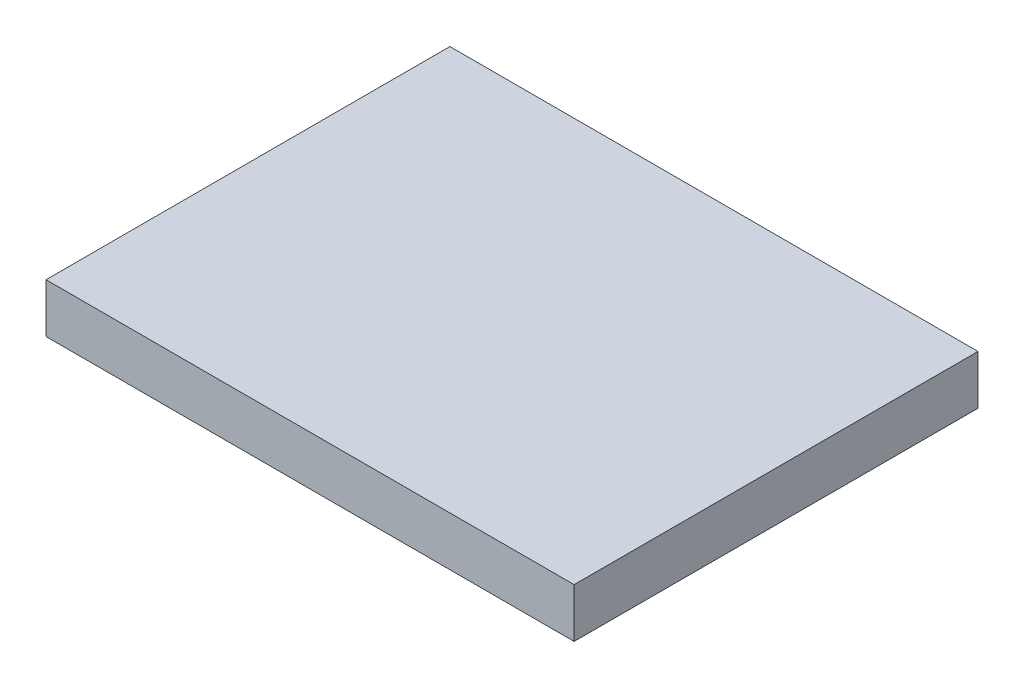
ISO-10303-21;
HEADER;
FILE_DESCRIPTION(('STEP AP214'),'2;1');
FILE_NAME('part.step','',(''),(''),'','','');
FILE_SCHEMA(('AUTOMOTIVE_DESIGN { 1 0 10303 214 1 1 1 1 }'));
ENDSEC;
DATA;
#1=APPLICATION_CONTEXT('core data for automotive mechanical design processes');
#2=APPLICATION_PROTOCOL_DEFINITION('international standard','automotive_design',2000,#1);
#3=PRODUCT_CONTEXT('',#1,'mechanical');
#4=PRODUCT('Part','Part','',(#3));
#5=PRODUCT_RELATED_PRODUCT_CATEGORY('part','',(#4));
#6=PRODUCT_DEFINITION_FORMATION('','',#4);
#7=PRODUCT_DEFINITION_CONTEXT('part definition',#1,'design');
#8=PRODUCT_DEFINITION('design','',#6,#7);
#9=PRODUCT_DEFINITION_SHAPE('','',#8);
#10=(LENGTH_UNIT() NAMED_UNIT(*) SI_UNIT(.MILLI.,.METRE.));
#11=(NAMED_UNIT(*) PLANE_ANGLE_UNIT() SI_UNIT($,.RADIAN.));
#12=(NAMED_UNIT(*) SI_UNIT($,.STERADIAN.) SOLID_ANGLE_UNIT());
#13=UNCERTAINTY_MEASURE_WITH_UNIT(LENGTH_MEASURE(1.E-05),#10,'distance_accuracy_value','');
#14=(GEOMETRIC_REPRESENTATION_CONTEXT(3) GLOBAL_UNCERTAINTY_ASSIGNED_CONTEXT((#13)) GLOBAL_UNIT_ASSIGNED_CONTEXT((#10,
#11,#12)) REPRESENTATION_CONTEXT('',''));
#15=CARTESIAN_POINT('',(0.,0.,0.));
#16=DIRECTION('',(0.,0.,1.));
#17=DIRECTION('',(1.,0.,0.));
#18=AXIS2_PLACEMENT_3D('',#15,#16,#17);
#19=CARTESIAN_POINT('',(6.81390113238513,1.27,5.21119480969736));
#20=DIRECTION('',(-1.,0.,0.));
#21=DIRECTION('',(0.,0.,1.));
#22=AXIS2_PLACEMENT_3D('',#19,#20,#21);
#23=PLANE('',#22);
#24=DIRECTION('',(0.,0.,-1.));
#25=VECTOR('',#24,1.);
#26=CARTESIAN_POINT('',(6.81390113238513,0.,5.21119480969736));
#27=LINE('',#26,#25);
#28=CARTESIAN_POINT('',(6.81390113238513,0.,5.21119480969736));
#29=VERTEX_POINT('',#28);
#30=CARTESIAN_POINT('',(6.81390113238513,0.,-5.21119480969736));
#31=VERTEX_POINT('',#30);
#32=EDGE_CURVE('E102',#29,#31,#27,.T.);
#33=ORIENTED_EDGE('',*,*,#32,.T.);
#34=DIRECTION('',(0.,-1.,0.));
#35=VECTOR('',#34,1.);
#36=CARTESIAN_POINT('',(6.81390113238513,1.27,-5.21119480969736));
#37=LINE('',#36,#35);
#38=CARTESIAN_POINT('',(6.81390113238513,1.27,-5.21119480969736));
#39=VERTEX_POINT('',#38);
#40=EDGE_CURVE('E11',#39,#31,#37,.T.);
#41=ORIENTED_EDGE('',*,*,#40,.F.);
#42=DIRECTION('',(0.,0.,-1.));
#43=VECTOR('',#42,1.);
#44=CARTESIAN_POINT('',(6.81390113238513,1.27,5.21119480969736));
#45=LINE('',#44,#43);
#46=CARTESIAN_POINT('',(6.81390113238513,1.27,5.21119480969736));
#47=VERTEX_POINT('',#46);
#48=EDGE_CURVE('E90',#47,#39,#45,.T.);
#49=ORIENTED_EDGE('',*,*,#48,.F.);
#50=DIRECTION('',(0.,-1.,0.));
#51=VECTOR('',#50,1.);
#52=CARTESIAN_POINT('',(6.81390113238513,1.27,5.21119480969736));
#53=LINE('',#52,#51);
#54=EDGE_CURVE('E98',#47,#29,#53,.T.);
#55=ORIENTED_EDGE('',*,*,#54,.T.);
#56=EDGE_LOOP('',(#33,#41,#49,#55));
#57=FACE_BOUND('',#56,.T.);
#58=ADVANCED_FACE('F39',(#57),#23,.F.);
#59=CARTESIAN_POINT('',(-6.81390113238513,1.27,-5.21119480969736));
#60=DIRECTION('',(0.,0.,1.));
#61=DIRECTION('',(1.,0.,0.));
#62=AXIS2_PLACEMENT_3D('',#59,#60,#61);
#63=PLANE('',#62);
#64=DIRECTION('',(-1.,0.,0.));
#65=VECTOR('',#64,1.);
#66=CARTESIAN_POINT('',(-6.81390113238513,0.,-5.21119480969736));
#67=LINE('',#66,#65);
#68=CARTESIAN_POINT('',(-6.81390113238513,0.,-5.21119480969736));
#69=VERTEX_POINT('',#68);
#70=EDGE_CURVE('E94',#31,#69,#67,.T.);
#71=ORIENTED_EDGE('',*,*,#70,.T.);
#72=DIRECTION('',(0.,-1.,0.));
#73=VECTOR('',#72,1.);
#74=CARTESIAN_POINT('',(-6.81390113238513,1.27,-5.21119480969736));
#75=LINE('',#74,#73);
#76=CARTESIAN_POINT('',(-6.81390113238513,1.27,-5.21119480969736));
#77=VERTEX_POINT('',#76);
#78=EDGE_CURVE('E47',#77,#69,#75,.T.);
#79=ORIENTED_EDGE('',*,*,#78,.F.);
#80=DIRECTION('',(-1.,0.,0.));
#81=VECTOR('',#80,1.);
#82=CARTESIAN_POINT('',(-6.81390113238513,1.27,-5.21119480969736));
#83=LINE('',#82,#81);
#84=EDGE_CURVE('E85',#39,#77,#83,.T.);
#85=ORIENTED_EDGE('',*,*,#84,.F.);
#86=ORIENTED_EDGE('',*,*,#40,.T.);
#87=EDGE_LOOP('',(#71,#79,#85,#86));
#88=FACE_BOUND('',#87,.T.);
#89=ADVANCED_FACE('F93',(#88),#63,.F.);
#90=CARTESIAN_POINT('',(-6.81390113238513,1.27,5.21119480969736));
#91=DIRECTION('',(1.,0.,0.));
#92=DIRECTION('',(0.,0.,-1.));
#93=AXIS2_PLACEMENT_3D('',#90,#91,#92);
#94=PLANE('',#93);
#95=DIRECTION('',(0.,0.,1.));
#96=VECTOR('',#95,1.);
#97=CARTESIAN_POINT('',(-6.81390113238513,0.,5.21119480969736));
#98=LINE('',#97,#96);
#99=CARTESIAN_POINT('',(-6.81390113238513,0.,5.21119480969736));
#100=VERTEX_POINT('',#99);
#101=EDGE_CURVE('E72',#69,#100,#98,.T.);
#102=ORIENTED_EDGE('',*,*,#101,.T.);
#103=DIRECTION('',(0.,-1.,0.));
#104=VECTOR('',#103,1.);
#105=CARTESIAN_POINT('',(-6.81390113238513,1.27,5.21119480969736));
#106=LINE('',#105,#104);
#107=CARTESIAN_POINT('',(-6.81390113238513,1.27,5.21119480969736));
#108=VERTEX_POINT('',#107);
#109=EDGE_CURVE('E95',#108,#100,#106,.T.);
#110=ORIENTED_EDGE('',*,*,#109,.F.);
#111=DIRECTION('',(0.,0.,1.));
#112=VECTOR('',#111,1.);
#113=CARTESIAN_POINT('',(-6.81390113238513,1.27,5.21119480969736));
#114=LINE('',#113,#112);
#115=EDGE_CURVE('E88',#77,#108,#114,.T.);
#116=ORIENTED_EDGE('',*,*,#115,.F.);
#117=ORIENTED_EDGE('',*,*,#78,.T.);
#118=EDGE_LOOP('',(#102,#110,#116,#117));
#119=FACE_BOUND('',#118,.T.);
#120=ADVANCED_FACE('F96',(#119),#94,.F.);
#121=CARTESIAN_POINT('',(-6.81390113238513,1.27,5.21119480969736));
#122=DIRECTION('',(0.,0.,-1.));
#123=DIRECTION('',(-1.,0.,0.));
#124=AXIS2_PLACEMENT_3D('',#121,#122,#123);
#125=PLANE('',#124);
#126=DIRECTION('',(1.,0.,0.));
#127=VECTOR('',#126,1.);
#128=CARTESIAN_POINT('',(-6.81390113238513,0.,5.21119480969736));
#129=LINE('',#128,#127);
#130=EDGE_CURVE('E78',#100,#29,#129,.T.);
#131=ORIENTED_EDGE('',*,*,#130,.T.);
#132=ORIENTED_EDGE('',*,*,#54,.F.);
#133=DIRECTION('',(1.,0.,0.));
#134=VECTOR('',#133,1.);
#135=CARTESIAN_POINT('',(-6.81390113238513,1.27,5.21119480969736));
#136=LINE('',#135,#134);
#137=EDGE_CURVE('E55',#108,#47,#136,.T.);
#138=ORIENTED_EDGE('',*,*,#137,.F.);
#139=ORIENTED_EDGE('',*,*,#109,.T.);
#140=EDGE_LOOP('',(#131,#132,#138,#139));
#141=FACE_BOUND('',#140,.T.);
#142=ADVANCED_FACE('F109',(#141),#125,.F.);
#143=CARTESIAN_POINT('',(0.,1.27,0.));
#144=DIRECTION('',(0.,-1.,0.));
#145=DIRECTION('',(0.,0.,-1.));
#146=AXIS2_PLACEMENT_3D('',#143,#144,#145);
#147=PLANE('',#146);
#148=ORIENTED_EDGE('',*,*,#48,.T.);
#149=ORIENTED_EDGE('',*,*,#84,.T.);
#150=ORIENTED_EDGE('',*,*,#115,.T.);
#151=ORIENTED_EDGE('',*,*,#137,.T.);
#152=EDGE_LOOP('',(#148,#149,#150,#151));
#153=FACE_BOUND('',#152,.T.);
#154=ADVANCED_FACE('F86',(#153),#147,.F.);
#155=CARTESIAN_POINT('',(0.,0.,0.));
#156=DIRECTION('',(0.,-1.,0.));
#157=DIRECTION('',(0.,0.,-1.));
#158=AXIS2_PLACEMENT_3D('',#155,#156,#157);
#159=PLANE('',#158);
#160=ORIENTED_EDGE('',*,*,#32,.F.);
#161=ORIENTED_EDGE('',*,*,#130,.F.);
#162=ORIENTED_EDGE('',*,*,#101,.F.);
#163=ORIENTED_EDGE('',*,*,#70,.F.);
#164=EDGE_LOOP('',(#160,#161,#162,#163));
#165=FACE_BOUND('',#164,.T.);
#166=ADVANCED_FACE('F112',(#165),#159,.T.);
#167=CLOSED_SHELL('',(#58,#89,#120,#142,#154,#166));
#168=MANIFOLD_SOLID_BREP('B2',#167);
#169=ADVANCED_BREP_SHAPE_REPRESENTATION('',(#18,#168),#14);
#170=SHAPE_DEFINITION_REPRESENTATION(#9,#169);
ENDSEC;
END-ISO-10303-21;
